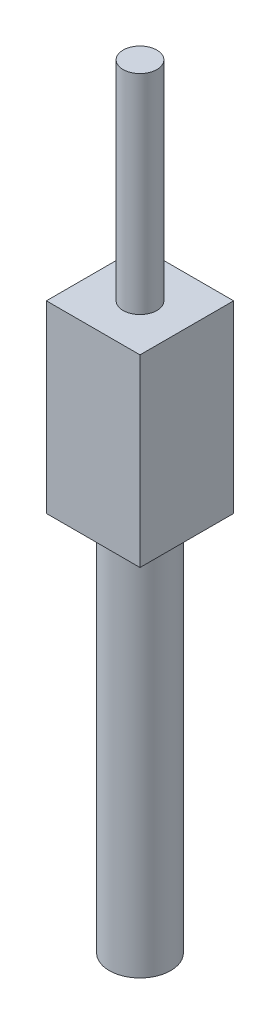
ISO-10303-21;
HEADER;
FILE_DESCRIPTION(('STEP AP214'),'2;1');
FILE_NAME('part.step','',(''),(''),'','','');
FILE_SCHEMA(('AUTOMOTIVE_DESIGN { 1 0 10303 214 1 1 1 1 }'));
ENDSEC;
DATA;
#1=APPLICATION_CONTEXT('core data for automotive mechanical design processes');
#2=APPLICATION_PROTOCOL_DEFINITION('international standard','automotive_design',2000,#1);
#3=PRODUCT_CONTEXT('',#1,'mechanical');
#4=PRODUCT('Part','Part','',(#3));
#5=PRODUCT_RELATED_PRODUCT_CATEGORY('part','',(#4));
#6=PRODUCT_DEFINITION_FORMATION('','',#4);
#7=PRODUCT_DEFINITION_CONTEXT('part definition',#1,'design');
#8=PRODUCT_DEFINITION('design','',#6,#7);
#9=PRODUCT_DEFINITION_SHAPE('','',#8);
#10=(LENGTH_UNIT() NAMED_UNIT(*) SI_UNIT(.MILLI.,.METRE.));
#11=(NAMED_UNIT(*) PLANE_ANGLE_UNIT() SI_UNIT($,.RADIAN.));
#12=(NAMED_UNIT(*) SI_UNIT($,.STERADIAN.) SOLID_ANGLE_UNIT());
#13=UNCERTAINTY_MEASURE_WITH_UNIT(LENGTH_MEASURE(1.E-05),#10,'distance_accuracy_value','');
#14=(GEOMETRIC_REPRESENTATION_CONTEXT(3) GLOBAL_UNCERTAINTY_ASSIGNED_CONTEXT((#13)) GLOBAL_UNIT_ASSIGNED_CONTEXT((#10,
#11,#12)) REPRESENTATION_CONTEXT('',''));
#15=CARTESIAN_POINT('',(0.,0.,0.));
#16=DIRECTION('',(0.,0.,1.));
#17=DIRECTION('',(1.,0.,0.));
#18=AXIS2_PLACEMENT_3D('',#15,#16,#17);
#19=CARTESIAN_POINT('',(0.,62.,0.));
#20=DIRECTION('',(0.,-1.,0.));
#21=DIRECTION('',(0.,0.,-1.));
#22=AXIS2_PLACEMENT_3D('',#19,#20,#21);
#23=CYLINDRICAL_SURFACE('',#22,5.);
#24=CARTESIAN_POINT('',(0.,62.,0.));
#25=DIRECTION('',(0.,1.,0.));
#26=DIRECTION('',(0.,0.,1.));
#27=AXIS2_PLACEMENT_3D('',#24,#25,#26);
#28=CIRCLE('',#27,5.);
#29=CARTESIAN_POINT('',(0.,62.,5.));
#30=VERTEX_POINT('',#29);
#31=EDGE_CURVE('E49',#30,#30,#28,.T.);
#32=ORIENTED_EDGE('',*,*,#31,.F.);
#33=EDGE_LOOP('',(#32));
#34=FACE_BOUND('',#33,.T.);
#35=CARTESIAN_POINT('',(0.,0.,0.));
#36=DIRECTION('',(0.,1.,0.));
#37=DIRECTION('',(0.,0.,1.));
#38=AXIS2_PLACEMENT_3D('',#35,#36,#37);
#39=CIRCLE('',#38,5.);
#40=CARTESIAN_POINT('',(0.,0.,5.));
#41=VERTEX_POINT('',#40);
#42=EDGE_CURVE('E42',#41,#41,#39,.T.);
#43=ORIENTED_EDGE('',*,*,#42,.T.);
#44=EDGE_LOOP('',(#43));
#45=FACE_BOUND('',#44,.T.);
#46=ADVANCED_FACE('F39',(#34,#45),#23,.T.);
#47=CARTESIAN_POINT('',(0.,0.,0.));
#48=DIRECTION('',(0.,1.,0.));
#49=DIRECTION('',(0.,0.,1.));
#50=AXIS2_PLACEMENT_3D('',#47,#48,#49);
#51=PLANE('',#50);
#52=CARTESIAN_POINT('',(0.,0.,0.));
#53=DIRECTION('',(0.,-1.,0.));
#54=DIRECTION('',(0.,0.,-1.));
#55=AXIS2_PLACEMENT_3D('',#52,#53,#54);
#56=CIRCLE('',#55,3.);
#57=CARTESIAN_POINT('',(0.,0.,-3.));
#58=VERTEX_POINT('',#57);
#59=EDGE_CURVE('E185',#58,#58,#56,.T.);
#60=ORIENTED_EDGE('',*,*,#59,.F.);
#61=EDGE_LOOP('',(#60));
#62=FACE_BOUND('',#61,.T.);
#63=ORIENTED_EDGE('',*,*,#42,.F.);
#64=EDGE_LOOP('',(#63));
#65=FACE_BOUND('',#64,.T.);
#66=ADVANCED_FACE('F138',(#62,#65),#51,.F.);
#67=CARTESIAN_POINT('',(7.625,92.,7.625));
#68=DIRECTION('',(-1.,0.,0.));
#69=DIRECTION('',(0.,0.,1.));
#70=AXIS2_PLACEMENT_3D('',#67,#68,#69);
#71=PLANE('',#70);
#72=DIRECTION('',(0.,0.,-1.));
#73=VECTOR('',#72,1.);
#74=CARTESIAN_POINT('',(7.625,62.,7.625));
#75=LINE('',#74,#73);
#76=CARTESIAN_POINT('',(7.625,62.,7.625));
#77=VERTEX_POINT('',#76);
#78=CARTESIAN_POINT('',(7.625,62.,-7.625));
#79=VERTEX_POINT('',#78);
#80=EDGE_CURVE('E113',#77,#79,#75,.T.);
#81=ORIENTED_EDGE('',*,*,#80,.T.);
#82=DIRECTION('',(0.,-1.,0.));
#83=VECTOR('',#82,1.);
#84=CARTESIAN_POINT('',(7.625,92.,-7.625));
#85=LINE('',#84,#83);
#86=CARTESIAN_POINT('',(7.625,92.,-7.625));
#87=VERTEX_POINT('',#86);
#88=EDGE_CURVE('E102',#87,#79,#85,.T.);
#89=ORIENTED_EDGE('',*,*,#88,.F.);
#90=DIRECTION('',(0.,0.,-1.));
#91=VECTOR('',#90,1.);
#92=CARTESIAN_POINT('',(7.625,92.,7.625));
#93=LINE('',#92,#91);
#94=CARTESIAN_POINT('',(7.625,92.,7.625));
#95=VERTEX_POINT('',#94);
#96=EDGE_CURVE('E94',#95,#87,#93,.T.);
#97=ORIENTED_EDGE('',*,*,#96,.F.);
#98=DIRECTION('',(0.,-1.,0.));
#99=VECTOR('',#98,1.);
#100=CARTESIAN_POINT('',(7.625,92.,7.625));
#101=LINE('',#100,#99);
#102=EDGE_CURVE('E109',#95,#77,#101,.T.);
#103=ORIENTED_EDGE('',*,*,#102,.T.);
#104=EDGE_LOOP('',(#81,#89,#97,#103));
#105=FACE_BOUND('',#104,.T.);
#106=ADVANCED_FACE('F140',(#105),#71,.F.);
#107=CARTESIAN_POINT('',(-7.625,92.,-7.625));
#108=DIRECTION('',(0.,0.,1.));
#109=DIRECTION('',(1.,0.,0.));
#110=AXIS2_PLACEMENT_3D('',#107,#108,#109);
#111=PLANE('',#110);
#112=DIRECTION('',(-1.,0.,0.));
#113=VECTOR('',#112,1.);
#114=CARTESIAN_POINT('',(-7.625,62.,-7.625));
#115=LINE('',#114,#113);
#116=CARTESIAN_POINT('',(-7.625,62.,-7.625));
#117=VERTEX_POINT('',#116);
#118=EDGE_CURVE('E100',#79,#117,#115,.T.);
#119=ORIENTED_EDGE('',*,*,#118,.T.);
#120=DIRECTION('',(0.,-1.,0.));
#121=VECTOR('',#120,1.);
#122=CARTESIAN_POINT('',(-7.625,92.,-7.625));
#123=LINE('',#122,#121);
#124=CARTESIAN_POINT('',(-7.625,92.,-7.625));
#125=VERTEX_POINT('',#124);
#126=EDGE_CURVE('E98',#125,#117,#123,.T.);
#127=ORIENTED_EDGE('',*,*,#126,.F.);
#128=DIRECTION('',(-1.,0.,0.));
#129=VECTOR('',#128,1.);
#130=CARTESIAN_POINT('',(-7.625,92.,-7.625));
#131=LINE('',#130,#129);
#132=EDGE_CURVE('E89',#87,#125,#131,.T.);
#133=ORIENTED_EDGE('',*,*,#132,.F.);
#134=ORIENTED_EDGE('',*,*,#88,.T.);
#135=EDGE_LOOP('',(#119,#127,#133,#134));
#136=FACE_BOUND('',#135,.T.);
#137=ADVANCED_FACE('F99',(#136),#111,.F.);
#138=CARTESIAN_POINT('',(-7.625,92.,7.625));
#139=DIRECTION('',(1.,0.,0.));
#140=DIRECTION('',(0.,0.,-1.));
#141=AXIS2_PLACEMENT_3D('',#138,#139,#140);
#142=PLANE('',#141);
#143=DIRECTION('',(0.,0.,1.));
#144=VECTOR('',#143,1.);
#145=CARTESIAN_POINT('',(-7.625,62.,7.625));
#146=LINE('',#145,#144);
#147=CARTESIAN_POINT('',(-7.625,62.,7.625));
#148=VERTEX_POINT('',#147);
#149=EDGE_CURVE('E75',#117,#148,#146,.T.);
#150=ORIENTED_EDGE('',*,*,#149,.T.);
#151=DIRECTION('',(0.,-1.,0.));
#152=VECTOR('',#151,1.);
#153=CARTESIAN_POINT('',(-7.625,92.,7.625));
#154=LINE('',#153,#152);
#155=CARTESIAN_POINT('',(-7.625,92.,7.625));
#156=VERTEX_POINT('',#155);
#157=EDGE_CURVE('E103',#156,#148,#154,.T.);
#158=ORIENTED_EDGE('',*,*,#157,.F.);
#159=DIRECTION('',(0.,0.,1.));
#160=VECTOR('',#159,1.);
#161=CARTESIAN_POINT('',(-7.625,92.,7.625));
#162=LINE('',#161,#160);
#163=EDGE_CURVE('E92',#125,#156,#162,.T.);
#164=ORIENTED_EDGE('',*,*,#163,.F.);
#165=ORIENTED_EDGE('',*,*,#126,.T.);
#166=EDGE_LOOP('',(#150,#158,#164,#165));
#167=FACE_BOUND('',#166,.T.);
#168=ADVANCED_FACE('F105',(#167),#142,.F.);
#169=CARTESIAN_POINT('',(-7.625,92.,7.625));
#170=DIRECTION('',(0.,0.,-1.));
#171=DIRECTION('',(-1.,0.,0.));
#172=AXIS2_PLACEMENT_3D('',#169,#170,#171);
#173=PLANE('',#172);
#174=DIRECTION('',(1.,0.,0.));
#175=VECTOR('',#174,1.);
#176=CARTESIAN_POINT('',(-7.625,62.,7.625));
#177=LINE('',#176,#175);
#178=EDGE_CURVE('E81',#148,#77,#177,.T.);
#179=ORIENTED_EDGE('',*,*,#178,.T.);
#180=ORIENTED_EDGE('',*,*,#102,.F.);
#181=DIRECTION('',(1.,0.,0.));
#182=VECTOR('',#181,1.);
#183=CARTESIAN_POINT('',(-7.625,92.,7.625));
#184=LINE('',#183,#182);
#185=EDGE_CURVE('E58',#156,#95,#184,.T.);
#186=ORIENTED_EDGE('',*,*,#185,.F.);
#187=ORIENTED_EDGE('',*,*,#157,.T.);
#188=EDGE_LOOP('',(#179,#180,#186,#187));
#189=FACE_BOUND('',#188,.T.);
#190=ADVANCED_FACE('F155',(#189),#173,.F.);
#191=CARTESIAN_POINT('',(0.,92.,0.));
#192=DIRECTION('',(0.,-1.,0.));
#193=DIRECTION('',(0.,0.,-1.));
#194=AXIS2_PLACEMENT_3D('',#191,#192,#193);
#195=PLANE('',#194);
#196=CARTESIAN_POINT('',(0.,92.,0.));
#197=DIRECTION('',(0.,1.,0.));
#198=DIRECTION('',(0.,0.,1.));
#199=AXIS2_PLACEMENT_3D('',#196,#197,#198);
#200=CIRCLE('',#199,2.75);
#201=CARTESIAN_POINT('',(0.,92.,2.75));
#202=VERTEX_POINT('',#201);
#203=EDGE_CURVE('E11',#202,#202,#200,.T.);
#204=ORIENTED_EDGE('',*,*,#203,.F.);
#205=EDGE_LOOP('',(#204));
#206=FACE_BOUND('',#205,.T.);
#207=ORIENTED_EDGE('',*,*,#96,.T.);
#208=ORIENTED_EDGE('',*,*,#132,.T.);
#209=ORIENTED_EDGE('',*,*,#163,.T.);
#210=ORIENTED_EDGE('',*,*,#185,.T.);
#211=EDGE_LOOP('',(#207,#208,#209,#210));
#212=FACE_BOUND('',#211,.T.);
#213=ADVANCED_FACE('F90',(#206,#212),#195,.F.);
#214=CARTESIAN_POINT('',(0.,62.,0.));
#215=DIRECTION('',(0.,-1.,0.));
#216=DIRECTION('',(0.,0.,-1.));
#217=AXIS2_PLACEMENT_3D('',#214,#215,#216);
#218=PLANE('',#217);
#219=ORIENTED_EDGE('',*,*,#31,.T.);
#220=EDGE_LOOP('',(#219));
#221=FACE_BOUND('',#220,.T.);
#222=ORIENTED_EDGE('',*,*,#80,.F.);
#223=ORIENTED_EDGE('',*,*,#178,.F.);
#224=ORIENTED_EDGE('',*,*,#149,.F.);
#225=ORIENTED_EDGE('',*,*,#118,.F.);
#226=EDGE_LOOP('',(#222,#223,#224,#225));
#227=FACE_BOUND('',#226,.T.);
#228=ADVANCED_FACE('F158',(#221,#227),#218,.T.);
#229=CARTESIAN_POINT('',(0.,10.,0.));
#230=DIRECTION('',(0.,-1.,0.));
#231=DIRECTION('',(0.,0.,-1.));
#232=AXIS2_PLACEMENT_3D('',#229,#230,#231);
#233=CYLINDRICAL_SURFACE('',#232,3.);
#234=CARTESIAN_POINT('',(0.,10.,0.));
#235=DIRECTION('',(0.,-1.,0.));
#236=DIRECTION('',(0.,0.,-1.));
#237=AXIS2_PLACEMENT_3D('',#234,#235,#236);
#238=CIRCLE('',#237,3.);
#239=CARTESIAN_POINT('',(0.,10.,-3.));
#240=VERTEX_POINT('',#239);
#241=EDGE_CURVE('E117',#240,#240,#238,.T.);
#242=ORIENTED_EDGE('',*,*,#241,.F.);
#243=EDGE_LOOP('',(#242));
#244=FACE_BOUND('',#243,.T.);
#245=ORIENTED_EDGE('',*,*,#59,.T.);
#246=EDGE_LOOP('',(#245));
#247=FACE_BOUND('',#246,.T.);
#248=ADVANCED_FACE('F161',(#244,#247),#233,.F.);
#249=CARTESIAN_POINT('',(0.,10.,0.));
#250=DIRECTION('',(0.,-1.,0.));
#251=DIRECTION('',(0.,0.,-1.));
#252=AXIS2_PLACEMENT_3D('',#249,#250,#251);
#253=PLANE('',#252);
#254=ORIENTED_EDGE('',*,*,#241,.T.);
#255=EDGE_LOOP('',(#254));
#256=FACE_BOUND('',#255,.T.);
#257=ADVANCED_FACE('F167',(#256),#253,.T.);
#258=CARTESIAN_POINT('',(0.,126.,0.));
#259=DIRECTION('',(0.,-1.,0.));
#260=DIRECTION('',(0.,0.,-1.));
#261=AXIS2_PLACEMENT_3D('',#258,#259,#260);
#262=CYLINDRICAL_SURFACE('',#261,2.75);
#263=CARTESIAN_POINT('',(0.,126.,0.));
#264=DIRECTION('',(0.,1.,0.));
#265=DIRECTION('',(0.,0.,1.));
#266=AXIS2_PLACEMENT_3D('',#263,#264,#265);
#267=CIRCLE('',#266,2.75);
#268=CARTESIAN_POINT('',(0.,126.,2.75));
#269=VERTEX_POINT('',#268);
#270=EDGE_CURVE('E183',#269,#269,#267,.T.);
#271=ORIENTED_EDGE('',*,*,#270,.F.);
#272=EDGE_LOOP('',(#271));
#273=FACE_BOUND('',#272,.T.);
#274=ORIENTED_EDGE('',*,*,#203,.T.);
#275=EDGE_LOOP('',(#274));
#276=FACE_BOUND('',#275,.T.);
#277=ADVANCED_FACE('F171',(#273,#276),#262,.T.);
#278=CARTESIAN_POINT('',(0.,126.,0.));
#279=DIRECTION('',(0.,1.,0.));
#280=DIRECTION('',(0.,0.,1.));
#281=AXIS2_PLACEMENT_3D('',#278,#279,#280);
#282=PLANE('',#281);
#283=ORIENTED_EDGE('',*,*,#270,.T.);
#284=EDGE_LOOP('',(#283));
#285=FACE_BOUND('',#284,.T.);
#286=ADVANCED_FACE('F175',(#285),#282,.T.);
#287=CLOSED_SHELL('',(#46,#66,#106,#137,#168,#190,#213,#228,#248,#257,#277,#286));
#288=MANIFOLD_SOLID_BREP('B2',#287);
#289=ADVANCED_BREP_SHAPE_REPRESENTATION('',(#18,#288),#14);
#290=SHAPE_DEFINITION_REPRESENTATION(#9,#289);
ENDSEC;
END-ISO-10303-21;
